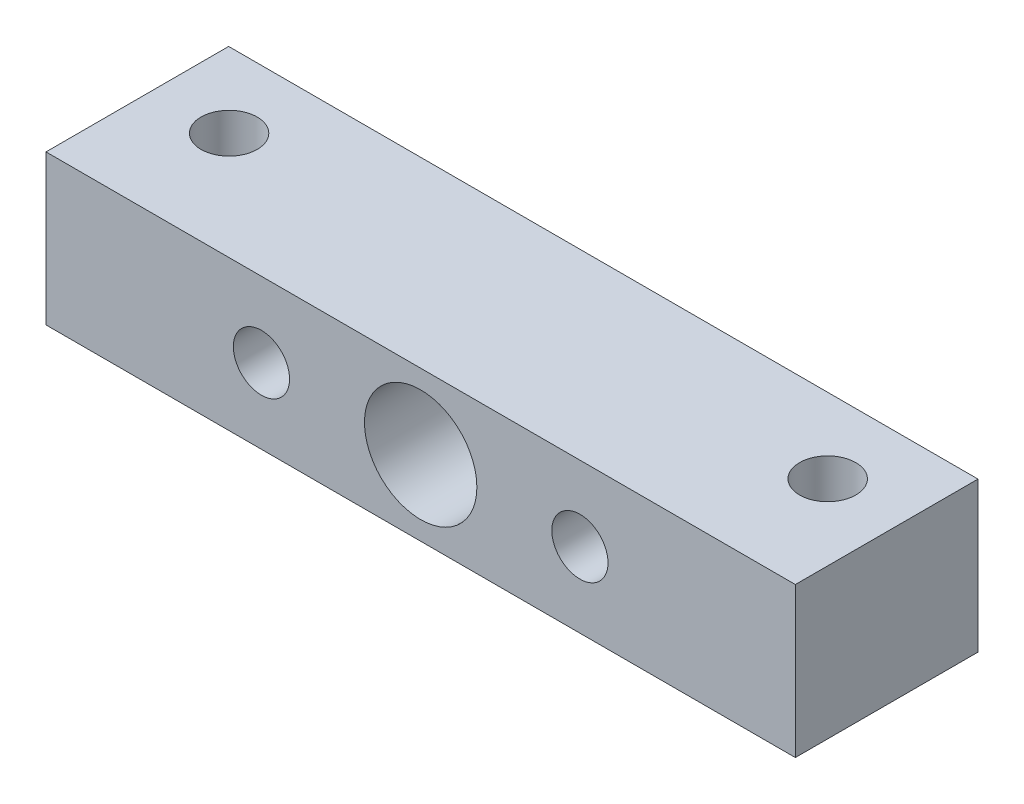
ISO-10303-21;
HEADER;
FILE_DESCRIPTION(('STEP AP214'),'2;1');
FILE_NAME('part.step','',(''),(''),'','','');
FILE_SCHEMA(('AUTOMOTIVE_DESIGN { 1 0 10303 214 1 1 1 1 }'));
ENDSEC;
DATA;
#1=APPLICATION_CONTEXT('core data for automotive mechanical design processes');
#2=APPLICATION_PROTOCOL_DEFINITION('international standard','automotive_design',2000,#1);
#3=PRODUCT_CONTEXT('',#1,'mechanical');
#4=PRODUCT('Part','Part','',(#3));
#5=PRODUCT_RELATED_PRODUCT_CATEGORY('part','',(#4));
#6=PRODUCT_DEFINITION_FORMATION('','',#4);
#7=PRODUCT_DEFINITION_CONTEXT('part definition',#1,'design');
#8=PRODUCT_DEFINITION('design','',#6,#7);
#9=PRODUCT_DEFINITION_SHAPE('','',#8);
#10=(LENGTH_UNIT() NAMED_UNIT(*) SI_UNIT(.MILLI.,.METRE.));
#11=(NAMED_UNIT(*) PLANE_ANGLE_UNIT() SI_UNIT($,.RADIAN.));
#12=(NAMED_UNIT(*) SI_UNIT($,.STERADIAN.) SOLID_ANGLE_UNIT());
#13=UNCERTAINTY_MEASURE_WITH_UNIT(LENGTH_MEASURE(1.E-05),#10,'distance_accuracy_value','');
#14=(GEOMETRIC_REPRESENTATION_CONTEXT(3) GLOBAL_UNCERTAINTY_ASSIGNED_CONTEXT((#13)) GLOBAL_UNIT_ASSIGNED_CONTEXT((#10,
#11,#12)) REPRESENTATION_CONTEXT('',''));
#15=CARTESIAN_POINT('',(0.,0.,0.));
#16=DIRECTION('',(0.,0.,1.));
#17=DIRECTION('',(1.,0.,0.));
#18=AXIS2_PLACEMENT_3D('',#15,#16,#17);
#19=CARTESIAN_POINT('',(0.,8.,0.));
#20=DIRECTION('',(0.,1.,0.));
#21=DIRECTION('',(0.,0.,1.));
#22=AXIS2_PLACEMENT_3D('',#19,#20,#21);
#23=PLANE('',#22);
#24=CARTESIAN_POINT('',(-15.9760563031056,8.,-0.874999999999995));
#25=DIRECTION('',(0.,1.,0.));
#26=DIRECTION('',(0.,0.,1.));
#27=AXIS2_PLACEMENT_3D('',#24,#25,#26);
#28=CIRCLE('',#27,1.5);
#29=CARTESIAN_POINT('',(-15.9760563031056,8.,0.625000000000005));
#30=VERTEX_POINT('',#29);
#31=EDGE_CURVE('E102',#30,#30,#28,.T.);
#32=ORIENTED_EDGE('',*,*,#31,.F.);
#33=EDGE_LOOP('',(#32));
#34=FACE_BOUND('',#33,.T.);
#35=DIRECTION('',(0.,0.,1.));
#36=VECTOR('',#35,1.);
#37=CARTESIAN_POINT('',(-20.,8.,4.875));
#38=LINE('',#37,#36);
#39=CARTESIAN_POINT('',(-20.,8.,-4.875));
#40=VERTEX_POINT('',#39);
#41=CARTESIAN_POINT('',(-20.,8.,4.875));
#42=VERTEX_POINT('',#41);
#43=EDGE_CURVE('E87',#40,#42,#38,.T.);
#44=ORIENTED_EDGE('',*,*,#43,.T.);
#45=DIRECTION('',(1.,0.,0.));
#46=VECTOR('',#45,1.);
#47=CARTESIAN_POINT('',(20.,8.,4.875));
#48=LINE('',#47,#46);
#49=CARTESIAN_POINT('',(20.,8.,4.875));
#50=VERTEX_POINT('',#49);
#51=EDGE_CURVE('E82',#42,#50,#48,.T.);
#52=ORIENTED_EDGE('',*,*,#51,.T.);
#53=DIRECTION('',(0.,0.,-1.));
#54=VECTOR('',#53,1.);
#55=CARTESIAN_POINT('',(20.,8.,4.875));
#56=LINE('',#55,#54);
#57=CARTESIAN_POINT('',(20.,8.,-4.875));
#58=VERTEX_POINT('',#57);
#59=EDGE_CURVE('E85',#50,#58,#56,.T.);
#60=ORIENTED_EDGE('',*,*,#59,.T.);
#61=DIRECTION('',(-1.,0.,0.));
#62=VECTOR('',#61,1.);
#63=CARTESIAN_POINT('',(20.,8.,-4.875));
#64=LINE('',#63,#62);
#65=EDGE_CURVE('E52',#58,#40,#64,.T.);
#66=ORIENTED_EDGE('',*,*,#65,.T.);
#67=EDGE_LOOP('',(#44,#52,#60,#66));
#68=FACE_BOUND('',#67,.T.);
#69=CARTESIAN_POINT('',(15.9760563031056,8.,-0.874999999999999));
#70=DIRECTION('',(0.,1.,0.));
#71=DIRECTION('',(0.,0.,-1.));
#72=AXIS2_PLACEMENT_3D('',#69,#70,#71);
#73=CIRCLE('',#72,1.5);
#74=CARTESIAN_POINT('',(15.9760563031056,8.,-2.375));
#75=VERTEX_POINT('',#74);
#76=EDGE_CURVE('E117',#75,#75,#73,.T.);
#77=ORIENTED_EDGE('',*,*,#76,.F.);
#78=EDGE_LOOP('',(#77));
#79=FACE_BOUND('',#78,.T.);
#80=ADVANCED_FACE('F35',(#34,#68,#79),#23,.T.);
#81=CARTESIAN_POINT('',(0.,0.,0.));
#82=DIRECTION('',(0.,1.,0.));
#83=DIRECTION('',(0.,0.,1.));
#84=AXIS2_PLACEMENT_3D('',#81,#82,#83);
#85=PLANE('',#84);
#86=DIRECTION('',(0.,0.,1.));
#87=VECTOR('',#86,1.);
#88=CARTESIAN_POINT('',(-20.,0.,4.875));
#89=LINE('',#88,#87);
#90=CARTESIAN_POINT('',(-20.,0.,-4.875));
#91=VERTEX_POINT('',#90);
#92=CARTESIAN_POINT('',(-20.,0.,4.875));
#93=VERTEX_POINT('',#92);
#94=EDGE_CURVE('E99',#91,#93,#89,.T.);
#95=ORIENTED_EDGE('',*,*,#94,.F.);
#96=DIRECTION('',(-1.,0.,0.));
#97=VECTOR('',#96,1.);
#98=CARTESIAN_POINT('',(20.,0.,-4.875));
#99=LINE('',#98,#97);
#100=CARTESIAN_POINT('',(20.,0.,-4.875));
#101=VERTEX_POINT('',#100);
#102=EDGE_CURVE('E75',#101,#91,#99,.T.);
#103=ORIENTED_EDGE('',*,*,#102,.F.);
#104=DIRECTION('',(0.,0.,-1.));
#105=VECTOR('',#104,1.);
#106=CARTESIAN_POINT('',(20.,0.,4.875));
#107=LINE('',#106,#105);
#108=CARTESIAN_POINT('',(20.,0.,4.875));
#109=VERTEX_POINT('',#108);
#110=EDGE_CURVE('E69',#109,#101,#107,.T.);
#111=ORIENTED_EDGE('',*,*,#110,.F.);
#112=DIRECTION('',(1.,0.,0.));
#113=VECTOR('',#112,1.);
#114=CARTESIAN_POINT('',(20.,0.,4.875));
#115=LINE('',#114,#113);
#116=EDGE_CURVE('E91',#93,#109,#115,.T.);
#117=ORIENTED_EDGE('',*,*,#116,.F.);
#118=EDGE_LOOP('',(#95,#103,#111,#117));
#119=FACE_BOUND('',#118,.T.);
#120=CARTESIAN_POINT('',(-15.9760563031056,0.,-0.874999999999995));
#121=DIRECTION('',(0.,1.,0.));
#122=DIRECTION('',(0.,0.,1.));
#123=AXIS2_PLACEMENT_3D('',#120,#121,#122);
#124=CIRCLE('',#123,1.5);
#125=CARTESIAN_POINT('',(-15.9760563031056,0.,0.625000000000005));
#126=VERTEX_POINT('',#125);
#127=EDGE_CURVE('E114',#126,#126,#124,.T.);
#128=ORIENTED_EDGE('',*,*,#127,.T.);
#129=EDGE_LOOP('',(#128));
#130=FACE_BOUND('',#129,.T.);
#131=CARTESIAN_POINT('',(15.9760563031056,0.,-0.874999999999999));
#132=DIRECTION('',(0.,1.,0.));
#133=DIRECTION('',(0.,0.,-1.));
#134=AXIS2_PLACEMENT_3D('',#131,#132,#133);
#135=CIRCLE('',#134,1.5);
#136=CARTESIAN_POINT('',(15.9760563031056,0.,-2.375));
#137=VERTEX_POINT('',#136);
#138=EDGE_CURVE('E120',#137,#137,#135,.T.);
#139=ORIENTED_EDGE('',*,*,#138,.T.);
#140=EDGE_LOOP('',(#139));
#141=FACE_BOUND('',#140,.T.);
#142=ADVANCED_FACE('F110',(#119,#130,#141),#85,.F.);
#143=CARTESIAN_POINT('',(-20.,8.,4.875));
#144=DIRECTION('',(1.,0.,0.));
#145=DIRECTION('',(0.,0.,-1.));
#146=AXIS2_PLACEMENT_3D('',#143,#144,#145);
#147=PLANE('',#146);
#148=ORIENTED_EDGE('',*,*,#94,.T.);
#149=DIRECTION('',(0.,-1.,0.));
#150=VECTOR('',#149,1.);
#151=CARTESIAN_POINT('',(-20.,8.,4.875));
#152=LINE('',#151,#150);
#153=EDGE_CURVE('E11',#42,#93,#152,.T.);
#154=ORIENTED_EDGE('',*,*,#153,.F.);
#155=ORIENTED_EDGE('',*,*,#43,.F.);
#156=DIRECTION('',(0.,-1.,0.));
#157=VECTOR('',#156,1.);
#158=CARTESIAN_POINT('',(-20.,8.,-4.875));
#159=LINE('',#158,#157);
#160=EDGE_CURVE('E95',#40,#91,#159,.T.);
#161=ORIENTED_EDGE('',*,*,#160,.T.);
#162=EDGE_LOOP('',(#148,#154,#155,#161));
#163=FACE_BOUND('',#162,.T.);
#164=ADVANCED_FACE('F37',(#163),#147,.F.);
#165=CARTESIAN_POINT('',(20.,8.,4.875));
#166=DIRECTION('',(0.,0.,-1.));
#167=DIRECTION('',(-1.,0.,0.));
#168=AXIS2_PLACEMENT_3D('',#165,#166,#167);
#169=PLANE('',#168);
#170=CARTESIAN_POINT('',(-8.5,4.,4.875));
#171=DIRECTION('',(0.,0.,1.));
#172=DIRECTION('',(-1.,0.,0.));
#173=AXIS2_PLACEMENT_3D('',#170,#171,#172);
#174=CIRCLE('',#173,1.5);
#175=CARTESIAN_POINT('',(-10.,4.,4.875));
#176=VERTEX_POINT('',#175);
#177=EDGE_CURVE('E140',#176,#176,#174,.T.);
#178=ORIENTED_EDGE('',*,*,#177,.F.);
#179=EDGE_LOOP('',(#178));
#180=FACE_BOUND('',#179,.T.);
#181=CARTESIAN_POINT('',(8.5,4.,4.875));
#182=DIRECTION('',(0.,0.,1.));
#183=DIRECTION('',(1.,0.,0.));
#184=AXIS2_PLACEMENT_3D('',#181,#182,#183);
#185=CIRCLE('',#184,1.5);
#186=CARTESIAN_POINT('',(10.,4.,4.875));
#187=VERTEX_POINT('',#186);
#188=EDGE_CURVE('E134',#187,#187,#185,.T.);
#189=ORIENTED_EDGE('',*,*,#188,.F.);
#190=EDGE_LOOP('',(#189));
#191=FACE_BOUND('',#190,.T.);
#192=CARTESIAN_POINT('',(0.,4.,4.875));
#193=DIRECTION('',(0.,0.,1.));
#194=DIRECTION('',(1.,0.,0.));
#195=AXIS2_PLACEMENT_3D('',#192,#193,#194);
#196=CIRCLE('',#195,3.);
#197=CARTESIAN_POINT('',(3.,4.,4.875));
#198=VERTEX_POINT('',#197);
#199=EDGE_CURVE('E128',#198,#198,#196,.T.);
#200=ORIENTED_EDGE('',*,*,#199,.F.);
#201=EDGE_LOOP('',(#200));
#202=FACE_BOUND('',#201,.T.);
#203=ORIENTED_EDGE('',*,*,#116,.T.);
#204=DIRECTION('',(0.,-1.,0.));
#205=VECTOR('',#204,1.);
#206=CARTESIAN_POINT('',(20.,8.,4.875));
#207=LINE('',#206,#205);
#208=EDGE_CURVE('E44',#50,#109,#207,.T.);
#209=ORIENTED_EDGE('',*,*,#208,.F.);
#210=ORIENTED_EDGE('',*,*,#51,.F.);
#211=ORIENTED_EDGE('',*,*,#153,.T.);
#212=EDGE_LOOP('',(#203,#209,#210,#211));
#213=FACE_BOUND('',#212,.T.);
#214=ADVANCED_FACE('F90',(#180,#191,#202,#213),#169,.F.);
#215=CARTESIAN_POINT('',(20.,8.,4.875));
#216=DIRECTION('',(-1.,0.,0.));
#217=DIRECTION('',(0.,0.,1.));
#218=AXIS2_PLACEMENT_3D('',#215,#216,#217);
#219=PLANE('',#218);
#220=ORIENTED_EDGE('',*,*,#110,.T.);
#221=DIRECTION('',(0.,-1.,0.));
#222=VECTOR('',#221,1.);
#223=CARTESIAN_POINT('',(20.,8.,-4.875));
#224=LINE('',#223,#222);
#225=EDGE_CURVE('E92',#58,#101,#224,.T.);
#226=ORIENTED_EDGE('',*,*,#225,.F.);
#227=ORIENTED_EDGE('',*,*,#59,.F.);
#228=ORIENTED_EDGE('',*,*,#208,.T.);
#229=EDGE_LOOP('',(#220,#226,#227,#228));
#230=FACE_BOUND('',#229,.T.);
#231=ADVANCED_FACE('F93',(#230),#219,.F.);
#232=CARTESIAN_POINT('',(20.,8.,-4.875));
#233=DIRECTION('',(0.,0.,1.));
#234=DIRECTION('',(1.,0.,0.));
#235=AXIS2_PLACEMENT_3D('',#232,#233,#234);
#236=PLANE('',#235);
#237=CARTESIAN_POINT('',(-8.5,4.,-4.875));
#238=DIRECTION('',(0.,0.,1.));
#239=DIRECTION('',(1.,0.,0.));
#240=AXIS2_PLACEMENT_3D('',#237,#238,#239);
#241=CIRCLE('',#240,1.5);
#242=CARTESIAN_POINT('',(-7.,4.,-4.875));
#243=VERTEX_POINT('',#242);
#244=EDGE_CURVE('E137',#243,#243,#241,.F.);
#245=ORIENTED_EDGE('',*,*,#244,.F.);
#246=EDGE_LOOP('',(#245));
#247=FACE_BOUND('',#246,.T.);
#248=CARTESIAN_POINT('',(8.5,4.,-4.875));
#249=DIRECTION('',(0.,0.,1.));
#250=DIRECTION('',(1.,0.,0.));
#251=AXIS2_PLACEMENT_3D('',#248,#249,#250);
#252=CIRCLE('',#251,1.5);
#253=CARTESIAN_POINT('',(10.,4.,-4.875));
#254=VERTEX_POINT('',#253);
#255=EDGE_CURVE('E131',#254,#254,#252,.F.);
#256=ORIENTED_EDGE('',*,*,#255,.F.);
#257=EDGE_LOOP('',(#256));
#258=FACE_BOUND('',#257,.T.);
#259=CARTESIAN_POINT('',(0.,4.,-4.875));
#260=DIRECTION('',(0.,0.,1.));
#261=DIRECTION('',(1.,0.,0.));
#262=AXIS2_PLACEMENT_3D('',#259,#260,#261);
#263=CIRCLE('',#262,3.);
#264=CARTESIAN_POINT('',(3.,4.,-4.875));
#265=VERTEX_POINT('',#264);
#266=EDGE_CURVE('E123',#265,#265,#263,.F.);
#267=ORIENTED_EDGE('',*,*,#266,.F.);
#268=EDGE_LOOP('',(#267));
#269=FACE_BOUND('',#268,.T.);
#270=ORIENTED_EDGE('',*,*,#102,.T.);
#271=ORIENTED_EDGE('',*,*,#160,.F.);
#272=ORIENTED_EDGE('',*,*,#65,.F.);
#273=ORIENTED_EDGE('',*,*,#225,.T.);
#274=EDGE_LOOP('',(#270,#271,#272,#273));
#275=FACE_BOUND('',#274,.T.);
#276=ADVANCED_FACE('F107',(#247,#258,#269,#275),#236,.F.);
#277=CARTESIAN_POINT('',(-15.9760563031056,8.,-0.874999999999995));
#278=DIRECTION('',(0.,-1.,0.));
#279=DIRECTION('',(0.,0.,-1.));
#280=AXIS2_PLACEMENT_3D('',#277,#278,#279);
#281=CYLINDRICAL_SURFACE('',#280,1.5);
#282=ORIENTED_EDGE('',*,*,#31,.T.);
#283=EDGE_LOOP('',(#282));
#284=FACE_BOUND('',#283,.T.);
#285=ORIENTED_EDGE('',*,*,#127,.F.);
#286=EDGE_LOOP('',(#285));
#287=FACE_BOUND('',#286,.T.);
#288=ADVANCED_FACE('F162',(#284,#287),#281,.F.);
#289=CARTESIAN_POINT('',(15.9760563031056,8.,-0.874999999999999));
#290=DIRECTION('',(0.,-1.,0.));
#291=DIRECTION('',(0.,0.,-1.));
#292=AXIS2_PLACEMENT_3D('',#289,#290,#291);
#293=CYLINDRICAL_SURFACE('',#292,1.5);
#294=ORIENTED_EDGE('',*,*,#76,.T.);
#295=EDGE_LOOP('',(#294));
#296=FACE_BOUND('',#295,.T.);
#297=ORIENTED_EDGE('',*,*,#138,.F.);
#298=EDGE_LOOP('',(#297));
#299=FACE_BOUND('',#298,.T.);
#300=ADVANCED_FACE('F157',(#296,#299),#293,.F.);
#301=CARTESIAN_POINT('',(0.,4.,-4.876));
#302=DIRECTION('',(0.,0.,1.));
#303=DIRECTION('',(1.,0.,0.));
#304=AXIS2_PLACEMENT_3D('',#301,#302,#303);
#305=CYLINDRICAL_SURFACE('',#304,3.);
#306=ORIENTED_EDGE('',*,*,#199,.T.);
#307=EDGE_LOOP('',(#306));
#308=FACE_BOUND('',#307,.T.);
#309=ORIENTED_EDGE('',*,*,#266,.T.);
#310=EDGE_LOOP('',(#309));
#311=FACE_BOUND('',#310,.T.);
#312=ADVANCED_FACE('F153',(#308,#311),#305,.F.);
#313=CARTESIAN_POINT('',(8.5,4.,-4.876));
#314=DIRECTION('',(0.,0.,1.));
#315=DIRECTION('',(1.,0.,0.));
#316=AXIS2_PLACEMENT_3D('',#313,#314,#315);
#317=CYLINDRICAL_SURFACE('',#316,1.5);
#318=ORIENTED_EDGE('',*,*,#188,.T.);
#319=EDGE_LOOP('',(#318));
#320=FACE_BOUND('',#319,.T.);
#321=ORIENTED_EDGE('',*,*,#255,.T.);
#322=EDGE_LOOP('',(#321));
#323=FACE_BOUND('',#322,.T.);
#324=ADVANCED_FACE('F156',(#320,#323),#317,.F.);
#325=CARTESIAN_POINT('',(-8.5,4.,-4.876));
#326=DIRECTION('',(0.,0.,1.));
#327=DIRECTION('',(1.,0.,0.));
#328=AXIS2_PLACEMENT_3D('',#325,#326,#327);
#329=CYLINDRICAL_SURFACE('',#328,1.5);
#330=ORIENTED_EDGE('',*,*,#177,.T.);
#331=EDGE_LOOP('',(#330));
#332=FACE_BOUND('',#331,.T.);
#333=ORIENTED_EDGE('',*,*,#244,.T.);
#334=EDGE_LOOP('',(#333));
#335=FACE_BOUND('',#334,.T.);
#336=ADVANCED_FACE('F144',(#332,#335),#329,.F.);
#337=CLOSED_SHELL('',(#80,#142,#164,#214,#231,#276,#288,#300,#312,#324,#336));
#338=MANIFOLD_SOLID_BREP('B2',#337);
#339=ADVANCED_BREP_SHAPE_REPRESENTATION('',(#18,#338),#14);
#340=SHAPE_DEFINITION_REPRESENTATION(#9,#339);
ENDSEC;
END-ISO-10303-21;
